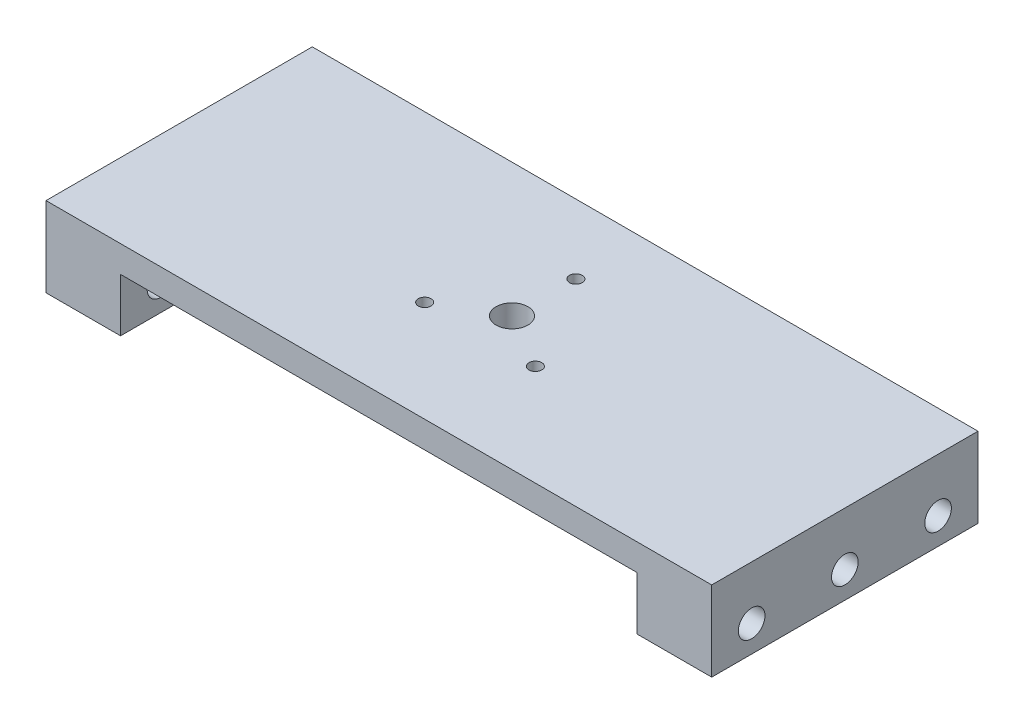
ISO-10303-21;
HEADER;
FILE_DESCRIPTION(('STEP AP214'),'2;1');
FILE_NAME('part.step','',(''),(''),'','','');
FILE_SCHEMA(('AUTOMOTIVE_DESIGN { 1 0 10303 214 1 1 1 1 }'));
ENDSEC;
DATA;
#1=APPLICATION_CONTEXT('core data for automotive mechanical design processes');
#2=APPLICATION_PROTOCOL_DEFINITION('international standard','automotive_design',2000,#1);
#3=PRODUCT_CONTEXT('',#1,'mechanical');
#4=PRODUCT('Part','Part','',(#3));
#5=PRODUCT_RELATED_PRODUCT_CATEGORY('part','',(#4));
#6=PRODUCT_DEFINITION_FORMATION('','',#4);
#7=PRODUCT_DEFINITION_CONTEXT('part definition',#1,'design');
#8=PRODUCT_DEFINITION('design','',#6,#7);
#9=PRODUCT_DEFINITION_SHAPE('','',#8);
#10=(LENGTH_UNIT() NAMED_UNIT(*) SI_UNIT(.MILLI.,.METRE.));
#11=(NAMED_UNIT(*) PLANE_ANGLE_UNIT() SI_UNIT($,.RADIAN.));
#12=(NAMED_UNIT(*) SI_UNIT($,.STERADIAN.) SOLID_ANGLE_UNIT());
#13=UNCERTAINTY_MEASURE_WITH_UNIT(LENGTH_MEASURE(1.E-05),#10,'distance_accuracy_value','');
#14=(GEOMETRIC_REPRESENTATION_CONTEXT(3) GLOBAL_UNCERTAINTY_ASSIGNED_CONTEXT((#13)) GLOBAL_UNIT_ASSIGNED_CONTEXT((#10,
#11,#12)) REPRESENTATION_CONTEXT('',''));
#15=CARTESIAN_POINT('',(0.,0.,0.));
#16=DIRECTION('',(0.,0.,1.));
#17=DIRECTION('',(1.,0.,0.));
#18=AXIS2_PLACEMENT_3D('',#15,#16,#17);
#19=CARTESIAN_POINT('',(0.,10.,50.));
#20=DIRECTION('',(0.,0.,-1.));
#21=DIRECTION('',(-1.,0.,0.));
#22=AXIS2_PLACEMENT_3D('',#19,#20,#21);
#23=PLANE('',#22);
#24=DIRECTION('',(0.,-1.,0.));
#25=VECTOR('',#24,1.);
#26=CARTESIAN_POINT('',(-125.,10.,50.));
#27=LINE('',#26,#25);
#28=CARTESIAN_POINT('',(-125.,10.,50.));
#29=VERTEX_POINT('',#28);
#30=CARTESIAN_POINT('',(-125.,-20.,50.));
#31=VERTEX_POINT('',#30);
#32=EDGE_CURVE('E184',#29,#31,#27,.T.);
#33=ORIENTED_EDGE('',*,*,#32,.T.);
#34=DIRECTION('',(-1.,0.,0.));
#35=VECTOR('',#34,1.);
#36=CARTESIAN_POINT('',(-125.,-20.,50.));
#37=LINE('',#36,#35);
#38=CARTESIAN_POINT('',(-97.,-20.,50.));
#39=VERTEX_POINT('',#38);
#40=EDGE_CURVE('E149',#39,#31,#37,.T.);
#41=ORIENTED_EDGE('',*,*,#40,.F.);
#42=DIRECTION('',(0.,1.,0.));
#43=VECTOR('',#42,1.);
#44=CARTESIAN_POINT('',(-97.,-20.,50.));
#45=LINE('',#44,#43);
#46=CARTESIAN_POINT('',(-97.,0.,50.));
#47=VERTEX_POINT('',#46);
#48=EDGE_CURVE('E163',#39,#47,#45,.T.);
#49=ORIENTED_EDGE('',*,*,#48,.T.);
#50=DIRECTION('',(1.,0.,0.));
#51=VECTOR('',#50,1.);
#52=CARTESIAN_POINT('',(0.,0.,50.));
#53=LINE('',#52,#51);
#54=CARTESIAN_POINT('',(97.,0.,50.));
#55=VERTEX_POINT('',#54);
#56=EDGE_CURVE('E114',#47,#55,#53,.T.);
#57=ORIENTED_EDGE('',*,*,#56,.T.);
#58=DIRECTION('',(0.,1.,0.));
#59=VECTOR('',#58,1.);
#60=CARTESIAN_POINT('',(97.,-20.,50.));
#61=LINE('',#60,#59);
#62=CARTESIAN_POINT('',(97.,-20.,50.));
#63=VERTEX_POINT('',#62);
#64=EDGE_CURVE('E108',#63,#55,#61,.T.);
#65=ORIENTED_EDGE('',*,*,#64,.F.);
#66=DIRECTION('',(1.,0.,0.));
#67=VECTOR('',#66,1.);
#68=CARTESIAN_POINT('',(125.,-20.,50.));
#69=LINE('',#68,#67);
#70=CARTESIAN_POINT('',(125.,-20.,50.));
#71=VERTEX_POINT('',#70);
#72=EDGE_CURVE('E111',#63,#71,#69,.T.);
#73=ORIENTED_EDGE('',*,*,#72,.T.);
#74=DIRECTION('',(0.,-1.,0.));
#75=VECTOR('',#74,1.);
#76=CARTESIAN_POINT('',(125.,10.,50.));
#77=LINE('',#76,#75);
#78=CARTESIAN_POINT('',(125.,10.,50.));
#79=VERTEX_POINT('',#78);
#80=EDGE_CURVE('E11',#79,#71,#77,.T.);
#81=ORIENTED_EDGE('',*,*,#80,.F.);
#82=DIRECTION('',(1.,0.,0.));
#83=VECTOR('',#82,1.);
#84=CARTESIAN_POINT('',(0.,10.,50.));
#85=LINE('',#84,#83);
#86=EDGE_CURVE('E173',#29,#79,#85,.T.);
#87=ORIENTED_EDGE('',*,*,#86,.F.);
#88=EDGE_LOOP('',(#33,#41,#49,#57,#65,#73,#81,#87));
#89=FACE_BOUND('',#88,.T.);
#90=ADVANCED_FACE('F41',(#89),#23,.F.);
#91=CARTESIAN_POINT('',(125.,10.,-50.));
#92=DIRECTION('',(-1.,0.,0.));
#93=DIRECTION('',(0.,0.,1.));
#94=AXIS2_PLACEMENT_3D('',#91,#92,#93);
#95=PLANE('',#94);
#96=CARTESIAN_POINT('',(125.,-10.,35.));
#97=DIRECTION('',(1.,0.,0.));
#98=DIRECTION('',(0.,0.,-1.));
#99=AXIS2_PLACEMENT_3D('',#96,#97,#98);
#100=CIRCLE('',#99,5.);
#101=CARTESIAN_POINT('',(125.,-10.,30.));
#102=VERTEX_POINT('',#101);
#103=EDGE_CURVE('E219',#102,#102,#100,.T.);
#104=ORIENTED_EDGE('',*,*,#103,.F.);
#105=EDGE_LOOP('',(#104));
#106=FACE_BOUND('',#105,.T.);
#107=CARTESIAN_POINT('',(125.,-10.,-35.));
#108=DIRECTION('',(1.,0.,0.));
#109=DIRECTION('',(0.,0.,-1.));
#110=AXIS2_PLACEMENT_3D('',#107,#108,#109);
#111=CIRCLE('',#110,5.);
#112=CARTESIAN_POINT('',(125.,-10.,-40.));
#113=VERTEX_POINT('',#112);
#114=EDGE_CURVE('E224',#113,#113,#111,.T.);
#115=ORIENTED_EDGE('',*,*,#114,.F.);
#116=EDGE_LOOP('',(#115));
#117=FACE_BOUND('',#116,.T.);
#118=CARTESIAN_POINT('',(125.,-10.,0.));
#119=DIRECTION('',(1.,0.,0.));
#120=DIRECTION('',(0.,0.,-1.));
#121=AXIS2_PLACEMENT_3D('',#118,#119,#120);
#122=CIRCLE('',#121,5.);
#123=CARTESIAN_POINT('',(125.,-10.,-5.));
#124=VERTEX_POINT('',#123);
#125=EDGE_CURVE('E201',#124,#124,#122,.T.);
#126=ORIENTED_EDGE('',*,*,#125,.F.);
#127=EDGE_LOOP('',(#126));
#128=FACE_BOUND('',#127,.T.);
#129=ORIENTED_EDGE('',*,*,#80,.T.);
#130=DIRECTION('',(0.,0.,-1.));
#131=VECTOR('',#130,1.);
#132=CARTESIAN_POINT('',(125.,-20.,50.));
#133=LINE('',#132,#131);
#134=CARTESIAN_POINT('',(125.,-20.,-50.));
#135=VERTEX_POINT('',#134);
#136=EDGE_CURVE('E130',#71,#135,#133,.T.);
#137=ORIENTED_EDGE('',*,*,#136,.T.);
#138=DIRECTION('',(0.,-1.,0.));
#139=VECTOR('',#138,1.);
#140=CARTESIAN_POINT('',(125.,10.,-50.));
#141=LINE('',#140,#139);
#142=CARTESIAN_POINT('',(125.,10.,-50.));
#143=VERTEX_POINT('',#142);
#144=EDGE_CURVE('E50',#143,#135,#141,.T.);
#145=ORIENTED_EDGE('',*,*,#144,.F.);
#146=DIRECTION('',(0.,0.,-1.));
#147=VECTOR('',#146,1.);
#148=CARTESIAN_POINT('',(125.,10.,-50.));
#149=LINE('',#148,#147);
#150=EDGE_CURVE('E176',#79,#143,#149,.T.);
#151=ORIENTED_EDGE('',*,*,#150,.F.);
#152=EDGE_LOOP('',(#129,#137,#145,#151));
#153=FACE_BOUND('',#152,.T.);
#154=ADVANCED_FACE('F238',(#106,#117,#128,#153),#95,.F.);
#155=CARTESIAN_POINT('',(-125.,10.,-50.));
#156=DIRECTION('',(0.,0.,1.));
#157=DIRECTION('',(1.,0.,0.));
#158=AXIS2_PLACEMENT_3D('',#155,#156,#157);
#159=PLANE('',#158);
#160=ORIENTED_EDGE('',*,*,#144,.T.);
#161=DIRECTION('',(-1.,0.,0.));
#162=VECTOR('',#161,1.);
#163=CARTESIAN_POINT('',(97.,-20.,-50.));
#164=LINE('',#163,#162);
#165=CARTESIAN_POINT('',(97.,-20.,-50.));
#166=VERTEX_POINT('',#165);
#167=EDGE_CURVE('E136',#135,#166,#164,.T.);
#168=ORIENTED_EDGE('',*,*,#167,.T.);
#169=DIRECTION('',(0.,1.,0.));
#170=VECTOR('',#169,1.);
#171=CARTESIAN_POINT('',(97.,-20.,-50.));
#172=LINE('',#171,#170);
#173=CARTESIAN_POINT('',(97.,0.,-50.));
#174=VERTEX_POINT('',#173);
#175=EDGE_CURVE('E121',#166,#174,#172,.T.);
#176=ORIENTED_EDGE('',*,*,#175,.T.);
#177=DIRECTION('',(-1.,0.,0.));
#178=VECTOR('',#177,1.);
#179=CARTESIAN_POINT('',(-125.,0.,-50.));
#180=LINE('',#179,#178);
#181=CARTESIAN_POINT('',(-97.,0.,-50.));
#182=VERTEX_POINT('',#181);
#183=EDGE_CURVE('E58',#174,#182,#180,.T.);
#184=ORIENTED_EDGE('',*,*,#183,.T.);
#185=DIRECTION('',(0.,1.,0.));
#186=VECTOR('',#185,1.);
#187=CARTESIAN_POINT('',(-97.,-20.,-50.));
#188=LINE('',#187,#186);
#189=CARTESIAN_POINT('',(-97.,-20.,-50.));
#190=VERTEX_POINT('',#189);
#191=EDGE_CURVE('E169',#190,#182,#188,.T.);
#192=ORIENTED_EDGE('',*,*,#191,.F.);
#193=DIRECTION('',(1.,0.,0.));
#194=VECTOR('',#193,1.);
#195=CARTESIAN_POINT('',(-97.,-20.,-50.));
#196=LINE('',#195,#194);
#197=CARTESIAN_POINT('',(-125.,-20.,-50.));
#198=VERTEX_POINT('',#197);
#199=EDGE_CURVE('E157',#198,#190,#196,.T.);
#200=ORIENTED_EDGE('',*,*,#199,.F.);
#201=DIRECTION('',(0.,-1.,0.));
#202=VECTOR('',#201,1.);
#203=CARTESIAN_POINT('',(-125.,10.,-50.));
#204=LINE('',#203,#202);
#205=CARTESIAN_POINT('',(-125.,10.,-50.));
#206=VERTEX_POINT('',#205);
#207=EDGE_CURVE('E191',#206,#198,#204,.T.);
#208=ORIENTED_EDGE('',*,*,#207,.F.);
#209=DIRECTION('',(-1.,0.,0.));
#210=VECTOR('',#209,1.);
#211=CARTESIAN_POINT('',(-125.,10.,-50.));
#212=LINE('',#211,#210);
#213=EDGE_CURVE('E179',#143,#206,#212,.T.);
#214=ORIENTED_EDGE('',*,*,#213,.F.);
#215=EDGE_LOOP('',(#160,#168,#176,#184,#192,#200,#208,#214));
#216=FACE_BOUND('',#215,.T.);
#217=ADVANCED_FACE('F241',(#216),#159,.F.);
#218=CARTESIAN_POINT('',(-125.,10.,50.));
#219=DIRECTION('',(1.,0.,0.));
#220=DIRECTION('',(0.,0.,-1.));
#221=AXIS2_PLACEMENT_3D('',#218,#219,#220);
#222=PLANE('',#221);
#223=CARTESIAN_POINT('',(-125.,-10.,35.));
#224=DIRECTION('',(1.,0.,0.));
#225=DIRECTION('',(0.,0.,-1.));
#226=AXIS2_PLACEMENT_3D('',#223,#224,#225);
#227=CIRCLE('',#226,5.);
#228=CARTESIAN_POINT('',(-125.,-10.,30.));
#229=VERTEX_POINT('',#228);
#230=EDGE_CURVE('E484',#229,#229,#227,.T.);
#231=ORIENTED_EDGE('',*,*,#230,.T.);
#232=EDGE_LOOP('',(#231));
#233=FACE_BOUND('',#232,.T.);
#234=CARTESIAN_POINT('',(-125.,-10.,-35.));
#235=DIRECTION('',(1.,0.,0.));
#236=DIRECTION('',(0.,0.,-1.));
#237=AXIS2_PLACEMENT_3D('',#234,#235,#236);
#238=CIRCLE('',#237,5.);
#239=CARTESIAN_POINT('',(-125.,-10.,-40.));
#240=VERTEX_POINT('',#239);
#241=EDGE_CURVE('E481',#240,#240,#238,.T.);
#242=ORIENTED_EDGE('',*,*,#241,.T.);
#243=EDGE_LOOP('',(#242));
#244=FACE_BOUND('',#243,.T.);
#245=CARTESIAN_POINT('',(-125.,-10.,0.));
#246=DIRECTION('',(1.,0.,0.));
#247=DIRECTION('',(0.,0.,-1.));
#248=AXIS2_PLACEMENT_3D('',#245,#246,#247);
#249=CIRCLE('',#248,5.);
#250=CARTESIAN_POINT('',(-125.,-10.,-5.));
#251=VERTEX_POINT('',#250);
#252=EDGE_CURVE('E212',#251,#251,#249,.T.);
#253=ORIENTED_EDGE('',*,*,#252,.T.);
#254=EDGE_LOOP('',(#253));
#255=FACE_BOUND('',#254,.T.);
#256=ORIENTED_EDGE('',*,*,#207,.T.);
#257=DIRECTION('',(0.,0.,-1.));
#258=VECTOR('',#257,1.);
#259=CARTESIAN_POINT('',(-125.,-20.,50.));
#260=LINE('',#259,#258);
#261=EDGE_CURVE('E153',#31,#198,#260,.T.);
#262=ORIENTED_EDGE('',*,*,#261,.F.);
#263=ORIENTED_EDGE('',*,*,#32,.F.);
#264=DIRECTION('',(0.,0.,1.));
#265=VECTOR('',#264,1.);
#266=CARTESIAN_POINT('',(-125.,10.,50.));
#267=LINE('',#266,#265);
#268=EDGE_CURVE('E66',#206,#29,#267,.T.);
#269=ORIENTED_EDGE('',*,*,#268,.F.);
#270=EDGE_LOOP('',(#256,#262,#263,#269));
#271=FACE_BOUND('',#270,.T.);
#272=ADVANCED_FACE('F253',(#233,#244,#255,#271),#222,.F.);
#273=CARTESIAN_POINT('',(0.,10.,0.));
#274=DIRECTION('',(0.,-1.,0.));
#275=DIRECTION('',(0.,0.,-1.));
#276=AXIS2_PLACEMENT_3D('',#273,#274,#275);
#277=PLANE('',#276);
#278=CARTESIAN_POINT('',(0.,10.,0.));
#279=DIRECTION('',(0.,1.,0.));
#280=DIRECTION('',(0.,0.,1.));
#281=AXIS2_PLACEMENT_3D('',#278,#279,#280);
#282=CIRCLE('',#281,6.);
#283=CARTESIAN_POINT('',(0.,10.,6.));
#284=VERTEX_POINT('',#283);
#285=EDGE_CURVE('E515',#284,#284,#282,.T.);
#286=ORIENTED_EDGE('',*,*,#285,.F.);
#287=EDGE_LOOP('',(#286));
#288=FACE_BOUND('',#287,.T.);
#289=CARTESIAN_POINT('',(1.65866639730658E-12,10.,-23.9999999999991));
#290=DIRECTION('',(0.,1.,0.));
#291=DIRECTION('',(0.,0.,1.));
#292=AXIS2_PLACEMENT_3D('',#289,#290,#291);
#293=CIRCLE('',#292,2.39999999999867);
#294=CARTESIAN_POINT('',(1.65866639730658E-12,10.,-21.6000000000005));
#295=VERTEX_POINT('',#294);
#296=EDGE_CURVE('E508',#295,#295,#293,.T.);
#297=ORIENTED_EDGE('',*,*,#296,.F.);
#298=EDGE_LOOP('',(#297));
#299=FACE_BOUND('',#298,.T.);
#300=CARTESIAN_POINT('',(20.7846096908265,10.,12.0000000000001));
#301=DIRECTION('',(0.,1.,0.));
#302=DIRECTION('',(0.,0.,1.));
#303=AXIS2_PLACEMENT_3D('',#300,#301,#302);
#304=CIRCLE('',#303,2.4);
#305=CARTESIAN_POINT('',(20.7846096908265,10.,14.4000000000001));
#306=VERTEX_POINT('',#305);
#307=EDGE_CURVE('E500',#306,#306,#304,.T.);
#308=ORIENTED_EDGE('',*,*,#307,.F.);
#309=EDGE_LOOP('',(#308));
#310=FACE_BOUND('',#309,.T.);
#311=CARTESIAN_POINT('',(-20.7846096908251,10.,11.999999999999));
#312=DIRECTION('',(0.,1.,0.));
#313=DIRECTION('',(0.,0.,1.));
#314=AXIS2_PLACEMENT_3D('',#311,#312,#313);
#315=CIRCLE('',#314,2.40000000000061);
#316=CARTESIAN_POINT('',(-20.7846096908251,10.,14.3999999999996));
#317=VERTEX_POINT('',#316);
#318=EDGE_CURVE('E491',#317,#317,#315,.T.);
#319=ORIENTED_EDGE('',*,*,#318,.F.);
#320=EDGE_LOOP('',(#319));
#321=FACE_BOUND('',#320,.T.);
#322=ORIENTED_EDGE('',*,*,#86,.T.);
#323=ORIENTED_EDGE('',*,*,#150,.T.);
#324=ORIENTED_EDGE('',*,*,#213,.T.);
#325=ORIENTED_EDGE('',*,*,#268,.T.);
#326=EDGE_LOOP('',(#322,#323,#324,#325));
#327=FACE_BOUND('',#326,.T.);
#328=ADVANCED_FACE('F248',(#288,#299,#310,#321,#327),#277,.F.);
#329=CARTESIAN_POINT('',(0.,0.,0.));
#330=DIRECTION('',(0.,-1.,0.));
#331=DIRECTION('',(0.,0.,-1.));
#332=AXIS2_PLACEMENT_3D('',#329,#330,#331);
#333=PLANE('',#332);
#334=CARTESIAN_POINT('',(0.,0.,0.));
#335=DIRECTION('',(0.,1.,0.));
#336=DIRECTION('',(0.,0.,1.));
#337=AXIS2_PLACEMENT_3D('',#334,#335,#336);
#338=CIRCLE('',#337,6.);
#339=CARTESIAN_POINT('',(0.,0.,6.));
#340=VERTEX_POINT('',#339);
#341=EDGE_CURVE('E496',#340,#340,#338,.T.);
#342=ORIENTED_EDGE('',*,*,#341,.T.);
#343=EDGE_LOOP('',(#342));
#344=FACE_BOUND('',#343,.T.);
#345=CARTESIAN_POINT('',(1.65866639730658E-12,0.,-23.9999999999991));
#346=DIRECTION('',(0.,1.,0.));
#347=DIRECTION('',(0.,0.,1.));
#348=AXIS2_PLACEMENT_3D('',#345,#346,#347);
#349=CIRCLE('',#348,2.39999999999867);
#350=CARTESIAN_POINT('',(1.65866639730658E-12,0.,-21.6000000000005));
#351=VERTEX_POINT('',#350);
#352=EDGE_CURVE('E489',#351,#351,#349,.T.);
#353=ORIENTED_EDGE('',*,*,#352,.T.);
#354=EDGE_LOOP('',(#353));
#355=FACE_BOUND('',#354,.T.);
#356=CARTESIAN_POINT('',(20.7846096908265,0.,12.0000000000001));
#357=DIRECTION('',(0.,1.,0.));
#358=DIRECTION('',(0.,0.,1.));
#359=AXIS2_PLACEMENT_3D('',#356,#357,#358);
#360=CIRCLE('',#359,2.4);
#361=CARTESIAN_POINT('',(20.7846096908265,0.,14.4000000000001));
#362=VERTEX_POINT('',#361);
#363=EDGE_CURVE('E504',#362,#362,#360,.T.);
#364=ORIENTED_EDGE('',*,*,#363,.T.);
#365=EDGE_LOOP('',(#364));
#366=FACE_BOUND('',#365,.T.);
#367=CARTESIAN_POINT('',(-20.7846096908251,0.,11.999999999999));
#368=DIRECTION('',(0.,1.,0.));
#369=DIRECTION('',(0.,0.,1.));
#370=AXIS2_PLACEMENT_3D('',#367,#368,#369);
#371=CIRCLE('',#370,2.40000000000061);
#372=CARTESIAN_POINT('',(-20.7846096908251,0.,14.3999999999996));
#373=VERTEX_POINT('',#372);
#374=EDGE_CURVE('E495',#373,#373,#371,.T.);
#375=ORIENTED_EDGE('',*,*,#374,.T.);
#376=EDGE_LOOP('',(#375));
#377=FACE_BOUND('',#376,.T.);
#378=DIRECTION('',(0.,0.,1.));
#379=VECTOR('',#378,1.);
#380=CARTESIAN_POINT('',(97.,0.,50.));
#381=LINE('',#380,#379);
#382=EDGE_CURVE('E132',#174,#55,#381,.T.);
#383=ORIENTED_EDGE('',*,*,#382,.T.);
#384=ORIENTED_EDGE('',*,*,#56,.F.);
#385=DIRECTION('',(0.,0.,1.));
#386=VECTOR('',#385,1.);
#387=CARTESIAN_POINT('',(-97.,0.,50.));
#388=LINE('',#387,#386);
#389=EDGE_CURVE('E120',#182,#47,#388,.T.);
#390=ORIENTED_EDGE('',*,*,#389,.F.);
#391=ORIENTED_EDGE('',*,*,#183,.F.);
#392=EDGE_LOOP('',(#383,#384,#390,#391));
#393=FACE_BOUND('',#392,.T.);
#394=ADVANCED_FACE('F261',(#344,#355,#366,#377,#393),#333,.T.);
#395=CARTESIAN_POINT('',(-97.,-20.,50.));
#396=DIRECTION('',(-1.,0.,0.));
#397=DIRECTION('',(0.,0.,1.));
#398=AXIS2_PLACEMENT_3D('',#395,#396,#397);
#399=PLANE('',#398);
#400=CARTESIAN_POINT('',(-97.,-10.,35.));
#401=DIRECTION('',(-1.,0.,0.));
#402=DIRECTION('',(0.,0.,1.));
#403=AXIS2_PLACEMENT_3D('',#400,#401,#402);
#404=CIRCLE('',#403,5.);
#405=CARTESIAN_POINT('',(-97.,-10.,40.));
#406=VERTEX_POINT('',#405);
#407=EDGE_CURVE('E44',#406,#406,#404,.F.);
#408=ORIENTED_EDGE('',*,*,#407,.F.);
#409=EDGE_LOOP('',(#408));
#410=FACE_BOUND('',#409,.T.);
#411=CARTESIAN_POINT('',(-97.,-10.,-35.));
#412=DIRECTION('',(-1.,0.,0.));
#413=DIRECTION('',(0.,0.,1.));
#414=AXIS2_PLACEMENT_3D('',#411,#412,#413);
#415=CIRCLE('',#414,5.);
#416=CARTESIAN_POINT('',(-97.,-10.,-30.));
#417=VERTEX_POINT('',#416);
#418=EDGE_CURVE('E211',#417,#417,#415,.F.);
#419=ORIENTED_EDGE('',*,*,#418,.F.);
#420=EDGE_LOOP('',(#419));
#421=FACE_BOUND('',#420,.T.);
#422=CARTESIAN_POINT('',(-97.,-10.,0.));
#423=DIRECTION('',(-1.,0.,0.));
#424=DIRECTION('',(0.,0.,1.));
#425=AXIS2_PLACEMENT_3D('',#422,#423,#424);
#426=CIRCLE('',#425,5.);
#427=CARTESIAN_POINT('',(-97.,-10.,5.));
#428=VERTEX_POINT('',#427);
#429=EDGE_CURVE('E208',#428,#428,#426,.F.);
#430=ORIENTED_EDGE('',*,*,#429,.F.);
#431=EDGE_LOOP('',(#430));
#432=FACE_BOUND('',#431,.T.);
#433=ORIENTED_EDGE('',*,*,#389,.T.);
#434=ORIENTED_EDGE('',*,*,#48,.F.);
#435=DIRECTION('',(0.,0.,1.));
#436=VECTOR('',#435,1.);
#437=CARTESIAN_POINT('',(-97.,-20.,50.));
#438=LINE('',#437,#436);
#439=EDGE_CURVE('E160',#190,#39,#438,.T.);
#440=ORIENTED_EDGE('',*,*,#439,.F.);
#441=ORIENTED_EDGE('',*,*,#191,.T.);
#442=EDGE_LOOP('',(#433,#434,#440,#441));
#443=FACE_BOUND('',#442,.T.);
#444=ADVANCED_FACE('F259',(#410,#421,#432,#443),#399,.F.);
#445=CARTESIAN_POINT('',(0.,-20.,0.));
#446=DIRECTION('',(0.,1.,0.));
#447=DIRECTION('',(0.,0.,1.));
#448=AXIS2_PLACEMENT_3D('',#445,#446,#447);
#449=PLANE('',#448);
#450=ORIENTED_EDGE('',*,*,#40,.T.);
#451=ORIENTED_EDGE('',*,*,#261,.T.);
#452=ORIENTED_EDGE('',*,*,#199,.T.);
#453=ORIENTED_EDGE('',*,*,#439,.T.);
#454=EDGE_LOOP('',(#450,#451,#452,#453));
#455=FACE_BOUND('',#454,.T.);
#456=ADVANCED_FACE('F255',(#455),#449,.F.);
#457=CARTESIAN_POINT('',(97.,-20.,50.));
#458=DIRECTION('',(-1.,0.,0.));
#459=DIRECTION('',(0.,0.,1.));
#460=AXIS2_PLACEMENT_3D('',#457,#458,#459);
#461=PLANE('',#460);
#462=CARTESIAN_POINT('',(97.,-10.,35.));
#463=DIRECTION('',(-1.,0.,0.));
#464=DIRECTION('',(0.,0.,1.));
#465=AXIS2_PLACEMENT_3D('',#462,#463,#464);
#466=CIRCLE('',#465,5.);
#467=CARTESIAN_POINT('',(97.,-10.,40.));
#468=VERTEX_POINT('',#467);
#469=EDGE_CURVE('E146',#468,#468,#466,.T.);
#470=ORIENTED_EDGE('',*,*,#469,.F.);
#471=EDGE_LOOP('',(#470));
#472=FACE_BOUND('',#471,.T.);
#473=CARTESIAN_POINT('',(97.,-10.,-35.));
#474=DIRECTION('',(-1.,0.,0.));
#475=DIRECTION('',(0.,0.,1.));
#476=AXIS2_PLACEMENT_3D('',#473,#474,#475);
#477=CIRCLE('',#476,5.);
#478=CARTESIAN_POINT('',(97.,-10.,-30.));
#479=VERTEX_POINT('',#478);
#480=EDGE_CURVE('E200',#479,#479,#477,.T.);
#481=ORIENTED_EDGE('',*,*,#480,.F.);
#482=EDGE_LOOP('',(#481));
#483=FACE_BOUND('',#482,.T.);
#484=CARTESIAN_POINT('',(97.,-10.,0.));
#485=DIRECTION('',(-1.,0.,0.));
#486=DIRECTION('',(0.,0.,1.));
#487=AXIS2_PLACEMENT_3D('',#484,#485,#486);
#488=CIRCLE('',#487,5.);
#489=CARTESIAN_POINT('',(97.,-10.,5.));
#490=VERTEX_POINT('',#489);
#491=EDGE_CURVE('E196',#490,#490,#488,.T.);
#492=ORIENTED_EDGE('',*,*,#491,.F.);
#493=EDGE_LOOP('',(#492));
#494=FACE_BOUND('',#493,.T.);
#495=ORIENTED_EDGE('',*,*,#382,.F.);
#496=ORIENTED_EDGE('',*,*,#175,.F.);
#497=DIRECTION('',(0.,0.,1.));
#498=VECTOR('',#497,1.);
#499=CARTESIAN_POINT('',(97.,-20.,50.));
#500=LINE('',#499,#498);
#501=EDGE_CURVE('E127',#166,#63,#500,.T.);
#502=ORIENTED_EDGE('',*,*,#501,.T.);
#503=ORIENTED_EDGE('',*,*,#64,.T.);
#504=EDGE_LOOP('',(#495,#496,#502,#503));
#505=FACE_BOUND('',#504,.T.);
#506=ADVANCED_FACE('F134',(#472,#483,#494,#505),#461,.T.);
#507=CARTESIAN_POINT('',(0.,-20.,0.));
#508=DIRECTION('',(0.,1.,0.));
#509=DIRECTION('',(0.,0.,1.));
#510=AXIS2_PLACEMENT_3D('',#507,#508,#509);
#511=PLANE('',#510);
#512=ORIENTED_EDGE('',*,*,#72,.F.);
#513=ORIENTED_EDGE('',*,*,#501,.F.);
#514=ORIENTED_EDGE('',*,*,#167,.F.);
#515=ORIENTED_EDGE('',*,*,#136,.F.);
#516=EDGE_LOOP('',(#512,#513,#514,#515));
#517=FACE_BOUND('',#516,.T.);
#518=ADVANCED_FACE('F125',(#517),#511,.F.);
#519=CARTESIAN_POINT('',(95.,-10.,0.));
#520=DIRECTION('',(1.,0.,0.));
#521=DIRECTION('',(0.,0.,-1.));
#522=AXIS2_PLACEMENT_3D('',#519,#520,#521);
#523=CYLINDRICAL_SURFACE('',#522,5.);
#524=ORIENTED_EDGE('',*,*,#491,.T.);
#525=EDGE_LOOP('',(#524));
#526=FACE_BOUND('',#525,.T.);
#527=ORIENTED_EDGE('',*,*,#125,.T.);
#528=EDGE_LOOP('',(#527));
#529=FACE_BOUND('',#528,.T.);
#530=ADVANCED_FACE('F236',(#526,#529),#523,.F.);
#531=CARTESIAN_POINT('',(95.,-10.,-35.));
#532=DIRECTION('',(1.,0.,0.));
#533=DIRECTION('',(0.,0.,-1.));
#534=AXIS2_PLACEMENT_3D('',#531,#532,#533);
#535=CYLINDRICAL_SURFACE('',#534,5.);
#536=ORIENTED_EDGE('',*,*,#480,.T.);
#537=EDGE_LOOP('',(#536));
#538=FACE_BOUND('',#537,.T.);
#539=ORIENTED_EDGE('',*,*,#114,.T.);
#540=EDGE_LOOP('',(#539));
#541=FACE_BOUND('',#540,.T.);
#542=ADVANCED_FACE('F376',(#538,#541),#535,.F.);
#543=CARTESIAN_POINT('',(95.,-10.,35.));
#544=DIRECTION('',(1.,0.,0.));
#545=DIRECTION('',(0.,0.,-1.));
#546=AXIS2_PLACEMENT_3D('',#543,#544,#545);
#547=CYLINDRICAL_SURFACE('',#546,5.);
#548=ORIENTED_EDGE('',*,*,#469,.T.);
#549=EDGE_LOOP('',(#548));
#550=FACE_BOUND('',#549,.T.);
#551=ORIENTED_EDGE('',*,*,#103,.T.);
#552=EDGE_LOOP('',(#551));
#553=FACE_BOUND('',#552,.T.);
#554=ADVANCED_FACE('F369',(#550,#553),#547,.F.);
#555=CARTESIAN_POINT('',(-95.,-10.,0.));
#556=DIRECTION('',(-1.,0.,0.));
#557=DIRECTION('',(0.,0.,1.));
#558=AXIS2_PLACEMENT_3D('',#555,#556,#557);
#559=CYLINDRICAL_SURFACE('',#558,5.);
#560=ORIENTED_EDGE('',*,*,#252,.F.);
#561=EDGE_LOOP('',(#560));
#562=FACE_BOUND('',#561,.T.);
#563=ORIENTED_EDGE('',*,*,#429,.T.);
#564=EDGE_LOOP('',(#563));
#565=FACE_BOUND('',#564,.T.);
#566=ADVANCED_FACE('F361',(#562,#565),#559,.F.);
#567=CARTESIAN_POINT('',(-95.,-10.,-35.));
#568=DIRECTION('',(-1.,0.,0.));
#569=DIRECTION('',(0.,0.,1.));
#570=AXIS2_PLACEMENT_3D('',#567,#568,#569);
#571=CYLINDRICAL_SURFACE('',#570,5.);
#572=ORIENTED_EDGE('',*,*,#241,.F.);
#573=EDGE_LOOP('',(#572));
#574=FACE_BOUND('',#573,.T.);
#575=ORIENTED_EDGE('',*,*,#418,.T.);
#576=EDGE_LOOP('',(#575));
#577=FACE_BOUND('',#576,.T.);
#578=ADVANCED_FACE('F353',(#574,#577),#571,.F.);
#579=CARTESIAN_POINT('',(-95.,-10.,35.));
#580=DIRECTION('',(-1.,0.,0.));
#581=DIRECTION('',(0.,0.,1.));
#582=AXIS2_PLACEMENT_3D('',#579,#580,#581);
#583=CYLINDRICAL_SURFACE('',#582,5.);
#584=ORIENTED_EDGE('',*,*,#230,.F.);
#585=EDGE_LOOP('',(#584));
#586=FACE_BOUND('',#585,.T.);
#587=ORIENTED_EDGE('',*,*,#407,.T.);
#588=EDGE_LOOP('',(#587));
#589=FACE_BOUND('',#588,.T.);
#590=ADVANCED_FACE('F345',(#586,#589),#583,.F.);
#591=CARTESIAN_POINT('',(-20.7846096908251,0.,11.999999999999));
#592=DIRECTION('',(0.,1.,0.));
#593=DIRECTION('',(0.,0.,1.));
#594=AXIS2_PLACEMENT_3D('',#591,#592,#593);
#595=CYLINDRICAL_SURFACE('',#594,2.40000000000061);
#596=ORIENTED_EDGE('',*,*,#374,.F.);
#597=EDGE_LOOP('',(#596));
#598=FACE_BOUND('',#597,.T.);
#599=ORIENTED_EDGE('',*,*,#318,.T.);
#600=EDGE_LOOP('',(#599));
#601=FACE_BOUND('',#600,.T.);
#602=ADVANCED_FACE('F337',(#598,#601),#595,.F.);
#603=CARTESIAN_POINT('',(20.7846096908265,0.,12.0000000000001));
#604=DIRECTION('',(0.,1.,0.));
#605=DIRECTION('',(0.,0.,1.));
#606=AXIS2_PLACEMENT_3D('',#603,#604,#605);
#607=CYLINDRICAL_SURFACE('',#606,2.4);
#608=ORIENTED_EDGE('',*,*,#363,.F.);
#609=EDGE_LOOP('',(#608));
#610=FACE_BOUND('',#609,.T.);
#611=ORIENTED_EDGE('',*,*,#307,.T.);
#612=EDGE_LOOP('',(#611));
#613=FACE_BOUND('',#612,.T.);
#614=ADVANCED_FACE('F332',(#610,#613),#607,.F.);
#615=CARTESIAN_POINT('',(1.65866639730658E-12,0.,-23.9999999999991));
#616=DIRECTION('',(0.,1.,0.));
#617=DIRECTION('',(0.,0.,1.));
#618=AXIS2_PLACEMENT_3D('',#615,#616,#617);
#619=CYLINDRICAL_SURFACE('',#618,2.39999999999867);
#620=ORIENTED_EDGE('',*,*,#352,.F.);
#621=EDGE_LOOP('',(#620));
#622=FACE_BOUND('',#621,.T.);
#623=ORIENTED_EDGE('',*,*,#296,.T.);
#624=EDGE_LOOP('',(#623));
#625=FACE_BOUND('',#624,.T.);
#626=ADVANCED_FACE('F311',(#622,#625),#619,.F.);
#627=CARTESIAN_POINT('',(0.,0.,0.));
#628=DIRECTION('',(0.,1.,0.));
#629=DIRECTION('',(0.,0.,1.));
#630=AXIS2_PLACEMENT_3D('',#627,#628,#629);
#631=CYLINDRICAL_SURFACE('',#630,6.);
#632=ORIENTED_EDGE('',*,*,#341,.F.);
#633=EDGE_LOOP('',(#632));
#634=FACE_BOUND('',#633,.T.);
#635=ORIENTED_EDGE('',*,*,#285,.T.);
#636=EDGE_LOOP('',(#635));
#637=FACE_BOUND('',#636,.T.);
#638=ADVANCED_FACE('F321',(#634,#637),#631,.F.);
#639=CLOSED_SHELL('',(#90,#154,#217,#272,#328,#394,#444,#456,#506,#518,#530,#542,#554,#566,#578,
#590,#602,#614,#626,#638));
#640=MANIFOLD_SOLID_BREP('B2',#639);
#641=ADVANCED_BREP_SHAPE_REPRESENTATION('',(#18,#640),#14);
#642=SHAPE_DEFINITION_REPRESENTATION(#9,#641);
ENDSEC;
END-ISO-10303-21;
